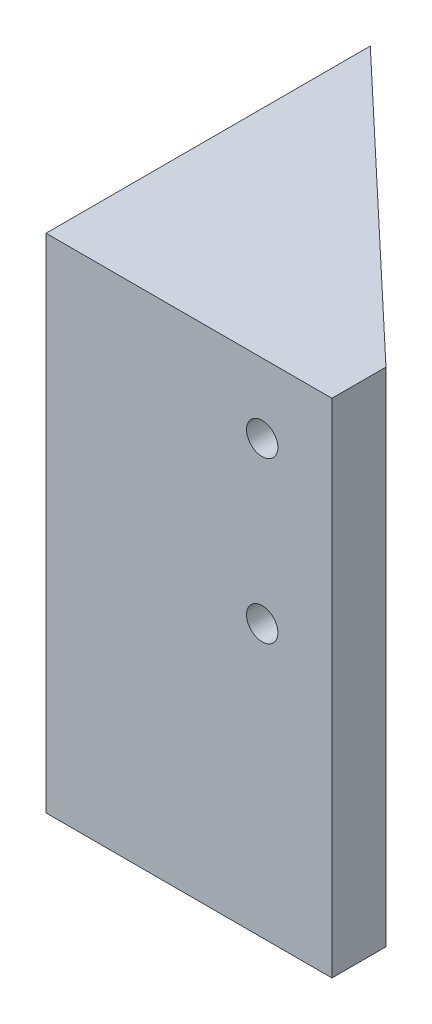
ISO-10303-21;
HEADER;
FILE_DESCRIPTION(('STEP AP214'),'2;1');
FILE_NAME('part.step','',(''),(''),'','','');
FILE_SCHEMA(('AUTOMOTIVE_DESIGN { 1 0 10303 214 1 1 1 1 }'));
ENDSEC;
DATA;
#1=APPLICATION_CONTEXT('core data for automotive mechanical design processes');
#2=APPLICATION_PROTOCOL_DEFINITION('international standard','automotive_design',2000,#1);
#3=PRODUCT_CONTEXT('',#1,'mechanical');
#4=PRODUCT('Part','Part','',(#3));
#5=PRODUCT_RELATED_PRODUCT_CATEGORY('part','',(#4));
#6=PRODUCT_DEFINITION_FORMATION('','',#4);
#7=PRODUCT_DEFINITION_CONTEXT('part definition',#1,'design');
#8=PRODUCT_DEFINITION('design','',#6,#7);
#9=PRODUCT_DEFINITION_SHAPE('','',#8);
#10=(LENGTH_UNIT() NAMED_UNIT(*) SI_UNIT(.MILLI.,.METRE.));
#11=(NAMED_UNIT(*) PLANE_ANGLE_UNIT() SI_UNIT($,.RADIAN.));
#12=(NAMED_UNIT(*) SI_UNIT($,.STERADIAN.) SOLID_ANGLE_UNIT());
#13=UNCERTAINTY_MEASURE_WITH_UNIT(LENGTH_MEASURE(1.E-05),#10,'distance_accuracy_value','');
#14=(GEOMETRIC_REPRESENTATION_CONTEXT(3) GLOBAL_UNCERTAINTY_ASSIGNED_CONTEXT((#13)) GLOBAL_UNIT_ASSIGNED_CONTEXT((#10,
#11,#12)) REPRESENTATION_CONTEXT('',''));
#15=CARTESIAN_POINT('',(0.,0.,0.));
#16=DIRECTION('',(0.,0.,1.));
#17=DIRECTION('',(1.,0.,0.));
#18=AXIS2_PLACEMENT_3D('',#15,#16,#17);
#19=CARTESIAN_POINT('',(10.,-23.225,5.));
#20=DIRECTION('',(-1.,0.,0.));
#21=DIRECTION('',(0.,0.,1.));
#22=AXIS2_PLACEMENT_3D('',#19,#20,#21);
#23=PLANE('',#22);
#24=DIRECTION('',(0.,1.,0.));
#25=VECTOR('',#24,1.);
#26=CARTESIAN_POINT('',(10.,-23.225,0.));
#27=LINE('',#26,#25);
#28=CARTESIAN_POINT('',(10.,-23.225,0.));
#29=VERTEX_POINT('',#28);
#30=CARTESIAN_POINT('',(10.,23.225,0.));
#31=VERTEX_POINT('',#30);
#32=EDGE_CURVE('E92',#29,#31,#27,.T.);
#33=ORIENTED_EDGE('',*,*,#32,.T.);
#34=DIRECTION('',(0.,0.,-1.));
#35=VECTOR('',#34,1.);
#36=CARTESIAN_POINT('',(10.,23.225,5.));
#37=LINE('',#36,#35);
#38=CARTESIAN_POINT('',(10.,23.225,5.));
#39=VERTEX_POINT('',#38);
#40=EDGE_CURVE('E11',#39,#31,#37,.T.);
#41=ORIENTED_EDGE('',*,*,#40,.F.);
#42=DIRECTION('',(0.,1.,0.));
#43=VECTOR('',#42,1.);
#44=CARTESIAN_POINT('',(10.,-23.225,5.));
#45=LINE('',#44,#43);
#46=CARTESIAN_POINT('',(10.,-23.225,5.));
#47=VERTEX_POINT('',#46);
#48=EDGE_CURVE('E107',#47,#39,#45,.T.);
#49=ORIENTED_EDGE('',*,*,#48,.F.);
#50=DIRECTION('',(0.,0.,-1.));
#51=VECTOR('',#50,1.);
#52=CARTESIAN_POINT('',(10.,-23.225,5.));
#53=LINE('',#52,#51);
#54=EDGE_CURVE('E44',#47,#29,#53,.T.);
#55=ORIENTED_EDGE('',*,*,#54,.T.);
#56=EDGE_LOOP('',(#33,#41,#49,#55));
#57=FACE_BOUND('',#56,.T.);
#58=ADVANCED_FACE('F36',(#57),#23,.F.);
#59=CARTESIAN_POINT('',(-10.,23.225,5.));
#60=DIRECTION('',(0.,-1.,0.));
#61=DIRECTION('',(0.,0.,-1.));
#62=AXIS2_PLACEMENT_3D('',#59,#60,#61);
#63=PLANE('',#62);
#64=ORIENTED_EDGE('',*,*,#40,.T.);
#65=DIRECTION('',(0.726746403426203,0.,0.686905863351798));
#66=VECTOR('',#65,1.);
#67=CARTESIAN_POINT('',(-16.45,23.225,-25.));
#68=LINE('',#67,#66);
#69=CARTESIAN_POINT('',(-16.45,23.225,-25.));
#70=VERTEX_POINT('',#69);
#71=EDGE_CURVE('E104',#70,#31,#68,.T.);
#72=ORIENTED_EDGE('',*,*,#71,.F.);
#73=DIRECTION('',(0.,0.,-1.));
#74=VECTOR('',#73,1.);
#75=CARTESIAN_POINT('',(-16.45,23.225,5.));
#76=LINE('',#75,#74);
#77=CARTESIAN_POINT('',(-16.45,23.225,5.));
#78=VERTEX_POINT('',#77);
#79=EDGE_CURVE('E79',#78,#70,#76,.T.);
#80=ORIENTED_EDGE('',*,*,#79,.F.);
#81=DIRECTION('',(-1.,0.,0.));
#82=VECTOR('',#81,1.);
#83=CARTESIAN_POINT('',(-10.,23.225,5.));
#84=LINE('',#83,#82);
#85=EDGE_CURVE('E109',#39,#78,#84,.T.);
#86=ORIENTED_EDGE('',*,*,#85,.F.);
#87=EDGE_LOOP('',(#64,#72,#80,#86));
#88=FACE_BOUND('',#87,.T.);
#89=ADVANCED_FACE('F117',(#88),#63,.F.);
#90=CARTESIAN_POINT('',(-10.,-23.225,5.));
#91=DIRECTION('',(0.,1.,0.));
#92=DIRECTION('',(0.,0.,1.));
#93=AXIS2_PLACEMENT_3D('',#90,#91,#92);
#94=PLANE('',#93);
#95=DIRECTION('',(1.,0.,0.));
#96=VECTOR('',#95,1.);
#97=CARTESIAN_POINT('',(-10.,-23.225,5.));
#98=LINE('',#97,#96);
#99=CARTESIAN_POINT('',(-16.45,-23.225,5.));
#100=VERTEX_POINT('',#99);
#101=EDGE_CURVE('E51',#100,#47,#98,.T.);
#102=ORIENTED_EDGE('',*,*,#101,.F.);
#103=DIRECTION('',(0.,0.,-1.));
#104=VECTOR('',#103,1.);
#105=CARTESIAN_POINT('',(-16.45,-23.225,5.));
#106=LINE('',#105,#104);
#107=CARTESIAN_POINT('',(-16.45,-23.225,-25.));
#108=VERTEX_POINT('',#107);
#109=EDGE_CURVE('E77',#100,#108,#106,.T.);
#110=ORIENTED_EDGE('',*,*,#109,.T.);
#111=DIRECTION('',(0.726746403426203,0.,0.686905863351798));
#112=VECTOR('',#111,1.);
#113=CARTESIAN_POINT('',(-16.45,-23.225,-25.));
#114=LINE('',#113,#112);
#115=EDGE_CURVE('E87',#108,#29,#114,.T.);
#116=ORIENTED_EDGE('',*,*,#115,.T.);
#117=ORIENTED_EDGE('',*,*,#54,.F.);
#118=EDGE_LOOP('',(#102,#110,#116,#117));
#119=FACE_BOUND('',#118,.T.);
#120=ADVANCED_FACE('F86',(#119),#94,.F.);
#121=CARTESIAN_POINT('',(0.,0.,5.));
#122=DIRECTION('',(0.,0.,-1.));
#123=DIRECTION('',(-1.,0.,0.));
#124=AXIS2_PLACEMENT_3D('',#121,#122,#123);
#125=PLANE('',#124);
#126=CARTESIAN_POINT('',(3.55,16.775,5.));
#127=DIRECTION('',(0.,0.,1.));
#128=DIRECTION('',(1.,0.,0.));
#129=AXIS2_PLACEMENT_3D('',#126,#127,#128);
#130=CIRCLE('',#129,1.45);
#131=CARTESIAN_POINT('',(5.,16.775,5.));
#132=VERTEX_POINT('',#131);
#133=EDGE_CURVE('E97',#132,#132,#130,.T.);
#134=ORIENTED_EDGE('',*,*,#133,.F.);
#135=EDGE_LOOP('',(#134));
#136=FACE_BOUND('',#135,.T.);
#137=CARTESIAN_POINT('',(3.55,1.935,5.));
#138=DIRECTION('',(0.,0.,1.));
#139=DIRECTION('',(1.,0.,0.));
#140=AXIS2_PLACEMENT_3D('',#137,#138,#139);
#141=CIRCLE('',#140,1.45);
#142=CARTESIAN_POINT('',(5.,1.935,5.));
#143=VERTEX_POINT('',#142);
#144=EDGE_CURVE('E100',#143,#143,#141,.T.);
#145=ORIENTED_EDGE('',*,*,#144,.F.);
#146=EDGE_LOOP('',(#145));
#147=FACE_BOUND('',#146,.T.);
#148=ORIENTED_EDGE('',*,*,#48,.T.);
#149=ORIENTED_EDGE('',*,*,#85,.T.);
#150=DIRECTION('',(0.,-1.,0.));
#151=VECTOR('',#150,1.);
#152=CARTESIAN_POINT('',(-16.45,63.2200309413557,5.));
#153=LINE('',#152,#151);
#154=EDGE_CURVE('E82',#78,#100,#153,.T.);
#155=ORIENTED_EDGE('',*,*,#154,.T.);
#156=ORIENTED_EDGE('',*,*,#101,.T.);
#157=EDGE_LOOP('',(#148,#149,#155,#156));
#158=FACE_BOUND('',#157,.T.);
#159=ADVANCED_FACE('F115',(#136,#147,#158),#125,.F.);
#160=CARTESIAN_POINT('',(-16.45,63.2200309413557,5.));
#161=DIRECTION('',(1.,0.,0.));
#162=DIRECTION('',(0.,0.,-1.));
#163=AXIS2_PLACEMENT_3D('',#160,#161,#162);
#164=PLANE('',#163);
#165=ORIENTED_EDGE('',*,*,#154,.F.);
#166=ORIENTED_EDGE('',*,*,#79,.T.);
#167=DIRECTION('',(0.,-1.,0.));
#168=VECTOR('',#167,1.);
#169=CARTESIAN_POINT('',(-16.45,63.2200309413557,-25.));
#170=LINE('',#169,#168);
#171=EDGE_CURVE('E73',#70,#108,#170,.T.);
#172=ORIENTED_EDGE('',*,*,#171,.T.);
#173=ORIENTED_EDGE('',*,*,#109,.F.);
#174=EDGE_LOOP('',(#165,#166,#172,#173));
#175=FACE_BOUND('',#174,.T.);
#176=ADVANCED_FACE('F76',(#175),#164,.F.);
#177=CARTESIAN_POINT('',(-16.45,63.2200309413557,-25.));
#178=DIRECTION('',(-0.686905863351798,0.,0.726746403426203));
#179=DIRECTION('',(0.726746403426203,0.,0.686905863351798));
#180=AXIS2_PLACEMENT_3D('',#177,#178,#179);
#181=PLANE('',#180);
#182=ORIENTED_EDGE('',*,*,#171,.F.);
#183=ORIENTED_EDGE('',*,*,#71,.T.);
#184=ORIENTED_EDGE('',*,*,#32,.F.);
#185=ORIENTED_EDGE('',*,*,#115,.F.);
#186=EDGE_LOOP('',(#182,#183,#184,#185));
#187=FACE_BOUND('',#186,.T.);
#188=ADVANCED_FACE('F90',(#187),#181,.F.);
#189=CARTESIAN_POINT('',(3.55,1.935,-2.5));
#190=DIRECTION('',(0.,0.,1.));
#191=DIRECTION('',(1.,0.,0.));
#192=AXIS2_PLACEMENT_3D('',#189,#190,#191);
#193=CYLINDRICAL_SURFACE('',#192,1.45);
#194=CARTESIAN_POINT('',(3.55,1.935,-2.5));
#195=DIRECTION('',(0.,0.,1.));
#196=DIRECTION('',(1.,0.,0.));
#197=AXIS2_PLACEMENT_3D('',#194,#195,#196);
#198=CIRCLE('',#197,1.45);
#199=CARTESIAN_POINT('',(5.,1.935,-2.5));
#200=VERTEX_POINT('',#199);
#201=EDGE_CURVE('E153',#200,#200,#198,.T.);
#202=ORIENTED_EDGE('',*,*,#201,.F.);
#203=EDGE_LOOP('',(#202));
#204=FACE_BOUND('',#203,.T.);
#205=ORIENTED_EDGE('',*,*,#144,.T.);
#206=EDGE_LOOP('',(#205));
#207=FACE_BOUND('',#206,.T.);
#208=ADVANCED_FACE('F130',(#204,#207),#193,.F.);
#209=CARTESIAN_POINT('',(3.55,1.935,-2.5));
#210=DIRECTION('',(0.,0.,1.));
#211=DIRECTION('',(1.,0.,0.));
#212=AXIS2_PLACEMENT_3D('',#209,#210,#211);
#213=PLANE('',#212);
#214=ORIENTED_EDGE('',*,*,#201,.T.);
#215=EDGE_LOOP('',(#214));
#216=FACE_BOUND('',#215,.T.);
#217=ADVANCED_FACE('F135',(#216),#213,.T.);
#218=CARTESIAN_POINT('',(3.55,16.775,-2.5));
#219=DIRECTION('',(0.,0.,1.));
#220=DIRECTION('',(1.,0.,0.));
#221=AXIS2_PLACEMENT_3D('',#218,#219,#220);
#222=CYLINDRICAL_SURFACE('',#221,1.45);
#223=CARTESIAN_POINT('',(3.55,16.775,-2.5));
#224=DIRECTION('',(0.,0.,1.));
#225=DIRECTION('',(1.,0.,0.));
#226=AXIS2_PLACEMENT_3D('',#223,#224,#225);
#227=CIRCLE('',#226,1.45);
#228=CARTESIAN_POINT('',(5.,16.775,-2.5));
#229=VERTEX_POINT('',#228);
#230=EDGE_CURVE('E94',#229,#229,#227,.T.);
#231=ORIENTED_EDGE('',*,*,#230,.F.);
#232=EDGE_LOOP('',(#231));
#233=FACE_BOUND('',#232,.T.);
#234=ORIENTED_EDGE('',*,*,#133,.T.);
#235=EDGE_LOOP('',(#234));
#236=FACE_BOUND('',#235,.T.);
#237=ADVANCED_FACE('F139',(#233,#236),#222,.F.);
#238=CARTESIAN_POINT('',(3.55,16.775,-2.5));
#239=DIRECTION('',(0.,0.,1.));
#240=DIRECTION('',(1.,0.,0.));
#241=AXIS2_PLACEMENT_3D('',#238,#239,#240);
#242=PLANE('',#241);
#243=ORIENTED_EDGE('',*,*,#230,.T.);
#244=EDGE_LOOP('',(#243));
#245=FACE_BOUND('',#244,.T.);
#246=ADVANCED_FACE('F143',(#245),#242,.T.);
#247=CLOSED_SHELL('',(#58,#89,#120,#159,#176,#188,#208,#217,#237,#246));
#248=MANIFOLD_SOLID_BREP('B2',#247);
#249=ADVANCED_BREP_SHAPE_REPRESENTATION('',(#18,#248),#14);
#250=SHAPE_DEFINITION_REPRESENTATION(#9,#249);
ENDSEC;
END-ISO-10303-21;
